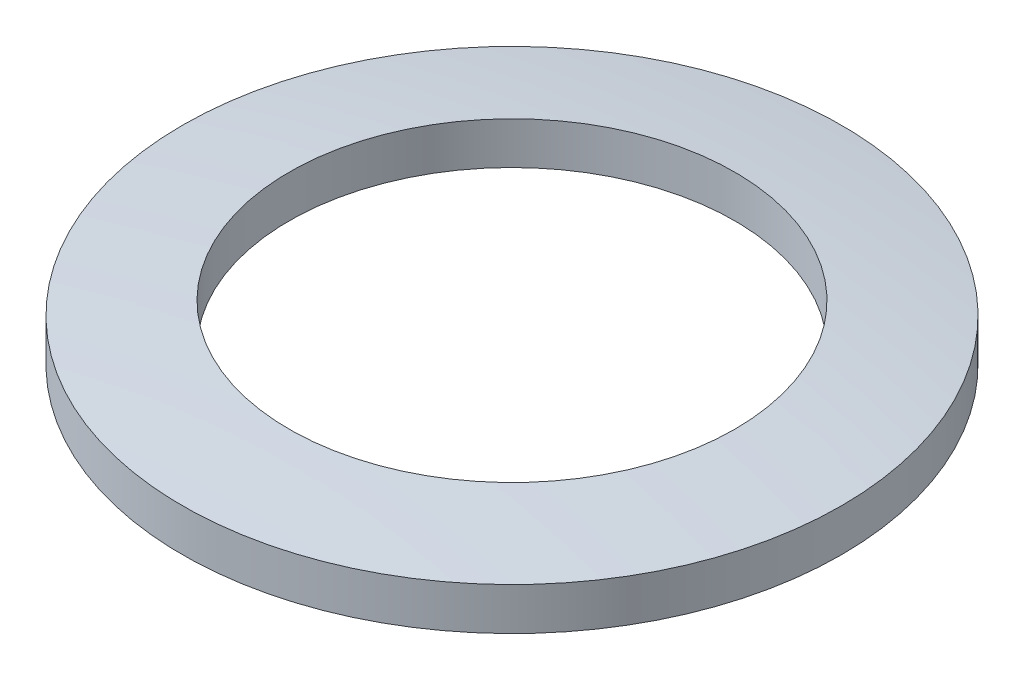
ISO-10303-21;
HEADER;
FILE_DESCRIPTION(('STEP AP214'),'2;1');
FILE_NAME('part.step','',(''),(''),'','','');
FILE_SCHEMA(('AUTOMOTIVE_DESIGN { 1 0 10303 214 1 1 1 1 }'));
ENDSEC;
DATA;
#1=APPLICATION_CONTEXT('core data for automotive mechanical design processes');
#2=APPLICATION_PROTOCOL_DEFINITION('international standard','automotive_design',2000,#1);
#3=PRODUCT_CONTEXT('',#1,'mechanical');
#4=PRODUCT('Part','Part','',(#3));
#5=PRODUCT_RELATED_PRODUCT_CATEGORY('part','',(#4));
#6=PRODUCT_DEFINITION_FORMATION('','',#4);
#7=PRODUCT_DEFINITION_CONTEXT('part definition',#1,'design');
#8=PRODUCT_DEFINITION('design','',#6,#7);
#9=PRODUCT_DEFINITION_SHAPE('','',#8);
#10=(LENGTH_UNIT() NAMED_UNIT(*) SI_UNIT(.MILLI.,.METRE.));
#11=(NAMED_UNIT(*) PLANE_ANGLE_UNIT() SI_UNIT($,.RADIAN.));
#12=(NAMED_UNIT(*) SI_UNIT($,.STERADIAN.) SOLID_ANGLE_UNIT());
#13=UNCERTAINTY_MEASURE_WITH_UNIT(LENGTH_MEASURE(1.E-05),#10,'distance_accuracy_value','');
#14=(GEOMETRIC_REPRESENTATION_CONTEXT(3) GLOBAL_UNCERTAINTY_ASSIGNED_CONTEXT((#13)) GLOBAL_UNIT_ASSIGNED_CONTEXT((#10,
#11,#12)) REPRESENTATION_CONTEXT('',''));
#15=CARTESIAN_POINT('',(0.,0.,0.));
#16=DIRECTION('',(0.,0.,1.));
#17=DIRECTION('',(1.,0.,0.));
#18=AXIS2_PLACEMENT_3D('',#15,#16,#17);
#19=CARTESIAN_POINT('',(0.,0.,0.));
#20=DIRECTION('',(0.,-1.,0.));
#21=DIRECTION('',(1.,0.,0.));
#22=AXIS2_PLACEMENT_3D('',#19,#20,#21);
#23=SPHERICAL_SURFACE('',#22,270.25);
#24=CARTESIAN_POINT('',(0.,267.38895657824,0.));
#25=DIRECTION('',(0.,-1.,0.));
#26=DIRECTION('',(0.,0.,-1.));
#27=AXIS2_PLACEMENT_3D('',#24,#25,#26);
#28=CIRCLE('',#27,39.22);
#29=CARTESIAN_POINT('',(39.2199999999998,267.38895657824,0.));
#30=VERTEX_POINT('',#29);
#31=EDGE_CURVE('E10',#30,#30,#28,.T.);
#32=CARTESIAN_POINT('',(0.,268.946616264269,0.));
#33=DIRECTION('',(0.,-1.,0.));
#34=DIRECTION('',(0.,0.,-1.));
#35=AXIS2_PLACEMENT_3D('',#32,#33,#34);
#36=CIRCLE('',#35,26.51);
#37=CARTESIAN_POINT('',(26.5099999999995,268.946616264269,0.));
#38=VERTEX_POINT('',#37);
#39=EDGE_CURVE('E50',#38,#38,#36,.T.);
#40=CARTESIAN_POINT('',(39.2199999999998,267.38895657824,0.));
#41=CARTESIAN_POINT('',(39.0880133827011,267.408316073179,0.));
#42=CARTESIAN_POINT('',(38.9560124312381,267.427577842536,0.));
#43=CARTESIAN_POINT('',(38.691982149495,267.465905888188,0.));
#44=CARTESIAN_POINT('',(38.5599528192149,267.484972164483,0.));
#45=CARTESIAN_POINT('',(38.2958660693495,267.522909182108,0.));
#46=CARTESIAN_POINT('',(38.1638086497641,267.54177992344,0.));
#47=CARTESIAN_POINT('',(37.8996660108778,267.579325829781,0.));
#48=CARTESIAN_POINT('',(37.7675807915769,267.598000994792,0.));
#49=CARTESIAN_POINT('',(37.503382842906,267.635155707534,0.));
#50=CARTESIAN_POINT('',(37.371270113536,267.653635255265,0.));
#51=CARTESIAN_POINT('',(37.1070174344348,267.690398692926,0.));
#52=CARTESIAN_POINT('',(36.9748774847036,267.708682582856,0.));
#53=CARTESIAN_POINT('',(36.7105706546472,267.74505466482,0.));
#54=CARTESIAN_POINT('',(36.5784037743221,267.763142856854,0.));
#55=CARTESIAN_POINT('',(36.3140433729042,267.79912350336,0.));
#56=CARTESIAN_POINT('',(36.1818498518116,267.817015957833,0.));
#57=CARTESIAN_POINT('',(35.9174364587435,267.852605089981,0.));
#58=CARTESIAN_POINT('',(35.785216586768,267.870301767656,0.));
#59=CARTESIAN_POINT('',(35.5207507818771,267.905499307403,0.));
#60=CARTESIAN_POINT('',(35.3885048489616,267.923000169474,0.));
#61=CARTESIAN_POINT('',(35.1239872121902,267.957806039636,0.));
#62=CARTESIAN_POINT('',(34.9917155083343,267.975111047726,0.));
#63=CARTESIAN_POINT('',(34.7271466197383,268.009525171977,0.));
#64=CARTESIAN_POINT('',(34.5948494349983,268.026634288137,0.));
#65=CARTESIAN_POINT('',(34.3302298747463,268.060656591012,0.));
#66=CARTESIAN_POINT('',(34.1979074992343,268.077569777725,0.));
#67=CARTESIAN_POINT('',(33.9332378476057,268.111200184616,0.));
#68=CARTESIAN_POINT('',(33.8008905714891,268.127917404793,0.));
#69=CARTESIAN_POINT('',(33.5361714088732,268.161155841952,0.));
#70=CARTESIAN_POINT('',(33.403799522374,268.177677058935,0.));
#71=CARTESIAN_POINT('',(33.1390314292689,268.210523453475,0.));
#72=CARTESIAN_POINT('',(33.006635222663,268.226848631033,0.));
#73=CARTESIAN_POINT('',(32.7418187796738,268.259302910926,0.));
#74=CARTESIAN_POINT('',(32.6093985432905,268.275432013261,0.));
#75=CARTESIAN_POINT('',(32.3445343311285,268.307494107339,0.));
#76=CARTESIAN_POINT('',(32.2120903553498,268.323427099081,0.));
#77=CARTESIAN_POINT('',(31.9471789548309,268.355096937035,0.));
#78=CARTESIAN_POINT('',(31.8147115300908,268.370833783245,0.));
#79=CARTESIAN_POINT('',(31.5497535221347,268.402111295626,0.));
#80=CARTESIAN_POINT('',(31.4172629389186,268.417651961796,0.));
#81=CARTESIAN_POINT('',(31.1522589045468,268.448537080017,0.));
#82=CARTESIAN_POINT('',(31.0197454533911,268.463881532068,0.));
#83=CARTESIAN_POINT('',(30.7546959737262,268.494374188401,0.));
#84=CARTESIAN_POINT('',(30.6221599452172,268.509522392683,0.));
#85=CARTESIAN_POINT('',(30.3570656014816,268.539622520262,0.));
#86=CARTESIAN_POINT('',(30.2245072862551,268.554574443557,0.));
#87=CARTESIAN_POINT('',(29.9593686597694,268.584281976376,0.));
#88=CARTESIAN_POINT('',(29.8267883485103,268.599037585897,0.));
#89=CARTESIAN_POINT('',(29.5616060206923,268.62835245881,0.));
#90=CARTESIAN_POINT('',(29.4290040041335,268.6429117222,0.));
#91=CARTESIAN_POINT('',(29.1637785564968,268.671833870923,0.));
#92=CARTESIAN_POINT('',(29.0311551254189,268.686196756255,0.));
#93=CARTESIAN_POINT('',(28.7658871395716,268.714726117365,0.));
#94=CARTESIAN_POINT('',(28.6332425848022,268.728892593143,0.));
#95=CARTESIAN_POINT('',(28.3679326424457,268.757029104079,0.));
#96=CARTESIAN_POINT('',(28.2352672548587,268.770999139238,0.));
#97=CARTESIAN_POINT('',(27.9699159377865,268.798742738299,0.));
#98=CARTESIAN_POINT('',(27.8372300083013,268.812516302201,0.));
#99=CARTESIAN_POINT('',(27.5718378983979,268.839866928554,0.));
#100=CARTESIAN_POINT('',(27.4391317179797,268.853443991003,0.));
#101=CARTESIAN_POINT('',(27.173699397217,268.880401584652,0.));
#102=CARTESIAN_POINT('',(27.0409732568724,268.893782115852,0.));
#103=CARTESIAN_POINT('',(26.7755013073188,268.920346617749,0.));
#104=CARTESIAN_POINT('',(26.6427554981098,268.933530588447,0.));
#105=CARTESIAN_POINT('',(26.5099999999995,268.946616264269,0.));
#106=B_SPLINE_CURVE_WITH_KNOTS('',3,(#40,#41,#42,#43,#44,#45,#46,#47,#48,#49,#50,#51,#52,#53,
#54,#55,#56,#57,#58,#59,#60,#61,#62,#63,#64,#65,#66,#67,#68,#69,#70,#71,#72,#73,#74,#75,#76,#77,
#78,#79,#80,#81,#82,#83,#84,#85,#86,#87,#88,#89,#90,#91,#92,#93,#94,#95,#96,#97,#98,#99,#100,
#101,#102,#103,#104,#105),.UNSPECIFIED.,.F.,.F.,(4,2,2,2,2,2,2,2,2,2,2,2,2,2,2,2,2,2,2,2,2,2,2,
2,2,2,2,2,2,2,2,2,4),(0.,0.40019655851181,0.80039311702367,1.20058967553547,1.60078623404727,
2.00098279255913,2.40117935107094,2.80137590958274,3.20157246809453,3.6017690266064,
4.0019655851182,4.40216214363,4.80235870214186,5.20255526065366,5.60275181916546,
6.00294837767732,6.40314493618911,6.80334149470091,7.20353805321278,7.60373461172458,
8.00393117023638,8.40412772874824,8.80432428726004,9.20452084577184,9.6047174042837,
10.0049139627955,10.4051105213073,10.8053070798191,11.205503638331,11.6057001968428,
12.0058967553546,12.4060933138664,12.8062898723782),.UNSPECIFIED.);
#107=EDGE_CURVE('BSEAM36',#30,#38,#106,.T.);
#108=ORIENTED_EDGE('',*,*,#31,.T.);
#109=ORIENTED_EDGE('',*,*,#39,.F.);
#110=ORIENTED_EDGE('',*,*,#107,.T.);
#111=ORIENTED_EDGE('',*,*,#107,.F.);
#112=EDGE_LOOP('',(#108,#110,#109,#111));
#113=FACE_BOUND('',#112,.T.);
#114=ADVANCED_FACE('F36',(#113),#23,.F.);
#115=CARTESIAN_POINT('',(0.,0.,0.));
#116=DIRECTION('',(0.,-1.,0.));
#117=DIRECTION('',(0.,0.,-1.));
#118=AXIS2_PLACEMENT_3D('',#115,#116,#117);
#119=CYLINDRICAL_SURFACE('',#118,39.22);
#120=CARTESIAN_POINT('',(0.,272.441469126857,0.));
#121=DIRECTION('',(0.,-1.,0.));
#122=DIRECTION('',(0.,0.,-1.));
#123=AXIS2_PLACEMENT_3D('',#120,#121,#122);
#124=CIRCLE('',#123,39.22);
#125=CARTESIAN_POINT('',(39.2199999999996,272.441469126857,0.));
#126=VERTEX_POINT('',#125);
#127=EDGE_CURVE('E42',#126,#126,#124,.T.);
#128=ORIENTED_EDGE('',*,*,#127,.T.);
#129=EDGE_LOOP('',(#128));
#130=FACE_BOUND('',#129,.T.);
#131=ORIENTED_EDGE('',*,*,#31,.F.);
#132=EDGE_LOOP('',(#131));
#133=FACE_BOUND('',#132,.T.);
#134=ADVANCED_FACE('F60',(#130,#133),#119,.T.);
#135=CARTESIAN_POINT('',(0.,0.,0.));
#136=DIRECTION('',(0.,-1.,0.));
#137=DIRECTION('',(1.,0.,0.));
#138=AXIS2_PLACEMENT_3D('',#135,#136,#137);
#139=SPHERICAL_SURFACE('',#138,275.25);
#140=CARTESIAN_POINT('',(0.,273.970404241042,0.));
#141=DIRECTION('',(0.,-1.,0.));
#142=DIRECTION('',(0.,0.,-1.));
#143=AXIS2_PLACEMENT_3D('',#140,#141,#142);
#144=CIRCLE('',#143,26.51);
#145=CARTESIAN_POINT('',(26.5099999999996,273.970404241042,0.));
#146=VERTEX_POINT('',#145);
#147=EDGE_CURVE('E46',#146,#146,#144,.T.);
#148=CARTESIAN_POINT('',(26.5099999999996,273.970404241042,0.));
#149=CARTESIAN_POINT('',(26.6427423576078,273.95755978841,0.));
#150=CARTESIAN_POINT('',(26.775475380236,273.944618862438,0.));
#151=CARTESIAN_POINT('',(27.0409224751281,273.918544091481,0.));
#152=CARTESIAN_POINT('',(27.1736365473921,273.905410246495,0.));
#153=CARTESIAN_POINT('',(27.4390454611519,273.878949665171,0.));
#154=CARTESIAN_POINT('',(27.5717403026476,273.865622928833,0.));
#155=CARTESIAN_POINT('',(27.8371104745183,273.838776592984,0.));
#156=CARTESIAN_POINT('',(27.9697858048931,273.825256993473,0.));
#157=CARTESIAN_POINT('',(28.2351166742076,273.798024959837,0.));
#158=CARTESIAN_POINT('',(28.3677722131473,273.784312525712,0.));
#159=CARTESIAN_POINT('',(28.6330632193196,273.756694851819,0.));
#160=CARTESIAN_POINT('',(28.7656986865522,273.742789612052,0.));
#161=CARTESIAN_POINT('',(29.030949269081,273.714786356254,0.));
#162=CARTESIAN_POINT('',(29.1635643843771,273.700688340223,0.));
#163=CARTESIAN_POINT('',(29.4287739828464,273.672299561684,0.));
#164=CARTESIAN_POINT('',(29.5613684660195,273.658008799176,0.));
#165=CARTESIAN_POINT('',(29.8265365200998,273.629234557875,0.));
#166=CARTESIAN_POINT('',(29.959110091007,273.614751079083,0.));
#167=CARTESIAN_POINT('',(30.2242360404567,273.585591435814,0.));
#168=CARTESIAN_POINT('',(30.3567884189992,273.570915271338,0.));
#169=CARTESIAN_POINT('',(30.6218717036656,273.541370287709,0.));
#170=CARTESIAN_POINT('',(30.7544026097895,273.526501468557,0.));
#171=CARTESIAN_POINT('',(31.0194426696101,273.49657120699,0.));
#172=CARTESIAN_POINT('',(31.1519518233068,273.481509764576,0.));
#173=CARTESIAN_POINT('',(31.4169480983103,273.451194288307,0.));
#174=CARTESIAN_POINT('',(31.5494352196172,273.435940254453,0.));
#175=CARTESIAN_POINT('',(31.814387149925,273.405239627532,0.));
#176=CARTESIAN_POINT('',(31.9468519589259,273.389793034466,0.));
#177=CARTESIAN_POINT('',(32.2117589847529,273.358707321756,0.));
#178=CARTESIAN_POINT('',(32.344201201579,273.343068202113,0.));
#179=CARTESIAN_POINT('',(32.6090627632351,273.311597469293,0.));
#180=CARTESIAN_POINT('',(32.7414821080651,273.295765856116,0.));
#181=CARTESIAN_POINT('',(33.0062976459561,273.263910169675,0.));
#182=CARTESIAN_POINT('',(33.1386938390172,273.247886096411,0.));
#183=CARTESIAN_POINT('',(33.4034627936464,273.215645523654,0.));
#184=CARTESIAN_POINT('',(33.5358355552145,273.19942902416,0.));
#185=CARTESIAN_POINT('',(33.8005573671834,273.166803633204,0.));
#186=CARTESIAN_POINT('',(33.9329064175842,273.150394741741,0.));
#187=CARTESIAN_POINT('',(34.1975805275939,273.117384601516,0.));
#188=CARTESIAN_POINT('',(34.3299055872029,273.100783352753,0.));
#189=CARTESIAN_POINT('',(34.5945314360555,273.067388533002,0.));
#190=CARTESIAN_POINT('',(34.726832225299,273.050594962013,0.));
#191=CARTESIAN_POINT('',(34.9914092538983,273.016815533292,0.));
#192=CARTESIAN_POINT('',(35.1236854932541,272.999829675559,0.));
#193=CARTESIAN_POINT('',(35.3882131426071,272.965665709237,0.));
#194=CARTESIAN_POINT('',(35.5204645526045,272.948487600647,0.));
#195=CARTESIAN_POINT('',(35.7849422638227,272.913939168904,0.));
#196=CARTESIAN_POINT('',(35.9171685650437,272.896568845751,0.));
#197=CARTESIAN_POINT('',(36.181595779344,272.861636021581,0.));
#198=CARTESIAN_POINT('',(36.3137966924235,272.844073520564,0.));
#199=CARTESIAN_POINT('',(36.5781728511295,272.808756377772,0.));
#200=CARTESIAN_POINT('',(36.7103480967561,272.791001735997,0.));
#201=CARTESIAN_POINT('',(36.9746726412992,272.7553003492,0.));
#202=CARTESIAN_POINT('',(37.1068219402158,272.737353604178,0.));
#203=CARTESIAN_POINT('',(37.3710943121366,272.701268048806,0.));
#204=CARTESIAN_POINT('',(37.5032173851409,272.683129238456,0.));
#205=CARTESIAN_POINT('',(37.7674370260899,272.646659590749,0.));
#206=CARTESIAN_POINT('',(37.8995335940347,272.628328753391,0.));
#207=CARTESIAN_POINT('',(38.1636999457748,272.591475090405,0.));
#208=CARTESIAN_POINT('',(38.2957697295701,272.572952264776,0.));
#209=CARTESIAN_POINT('',(38.5598822339735,272.535714664358,0.));
#210=CARTESIAN_POINT('',(38.6919249545817,272.516999889569,0.));
#211=CARTESIAN_POINT('',(38.955983053646,272.479378430457,0.));
#212=CARTESIAN_POINT('',(39.087998432102,272.460471746134,0.));
#213=CARTESIAN_POINT('',(39.2199999999996,272.441469126857,0.));
#214=B_SPLINE_CURVE_WITH_KNOTS('',3,(#148,#149,#150,#151,#152,#153,#154,#155,#156,#157,#158,
#159,#160,#161,#162,#163,#164,#165,#166,#167,#168,#169,#170,#171,#172,#173,#174,#175,#176,#177,
#178,#179,#180,#181,#182,#183,#184,#185,#186,#187,#188,#189,#190,#191,#192,#193,#194,#195,#196,
#197,#198,#199,#200,#201,#202,#203,#204,#205,#206,#207,#208,#209,#210,#211,#212,#213),
.UNSPECIFIED.,.F.,.F.,(4,2,2,2,2,2,2,2,2,2,2,2,2,2,2,2,2,2,2,2,2,2,2,2,2,2,2,2,2,2,2,2,4),(0.,
0.400086981815737,0.800173963631532,1.20026094544727,1.60034792726307,2.00043490907881,
2.40052189089461,2.80060887271034,3.20069585452614,3.60078283634188,4.00086981815761,
4.40095679997342,4.80104378178916,5.20113076360495,5.60121774542068,6.00130472723648,
6.40139170905222,6.80147869086796,7.20156567268376,7.60165265449949,8.00173963631528,
8.40182661813103,8.80191359994683,9.20200058176256,9.6020875635783,10.0021745453941,
10.4022615272098,10.8023485090256,11.2024354908414,11.6025224726572,12.0026094544729,
12.4026964362887,12.8027834181044),.UNSPECIFIED.);
#215=EDGE_CURVE('BSEAM64',#146,#126,#214,.T.);
#216=ORIENTED_EDGE('',*,*,#147,.T.);
#217=ORIENTED_EDGE('',*,*,#127,.F.);
#218=ORIENTED_EDGE('',*,*,#215,.T.);
#219=ORIENTED_EDGE('',*,*,#215,.F.);
#220=EDGE_LOOP('',(#216,#218,#217,#219));
#221=FACE_BOUND('',#220,.T.);
#222=ADVANCED_FACE('F64',(#221),#139,.T.);
#223=CARTESIAN_POINT('',(0.,0.,0.));
#224=DIRECTION('',(0.,-1.,0.));
#225=DIRECTION('',(0.,0.,-1.));
#226=AXIS2_PLACEMENT_3D('',#223,#224,#225);
#227=CYLINDRICAL_SURFACE('',#226,26.51);
#228=ORIENTED_EDGE('',*,*,#39,.T.);
#229=EDGE_LOOP('',(#228));
#230=FACE_BOUND('',#229,.T.);
#231=ORIENTED_EDGE('',*,*,#147,.F.);
#232=EDGE_LOOP('',(#231));
#233=FACE_BOUND('',#232,.T.);
#234=ADVANCED_FACE('F56',(#230,#233),#227,.F.);
#235=CLOSED_SHELL('',(#114,#134,#222,#234));
#236=MANIFOLD_SOLID_BREP('B2',#235);
#237=ADVANCED_BREP_SHAPE_REPRESENTATION('',(#18,#236),#14);
#238=SHAPE_DEFINITION_REPRESENTATION(#9,#237);
ENDSEC;
END-ISO-10303-21;
